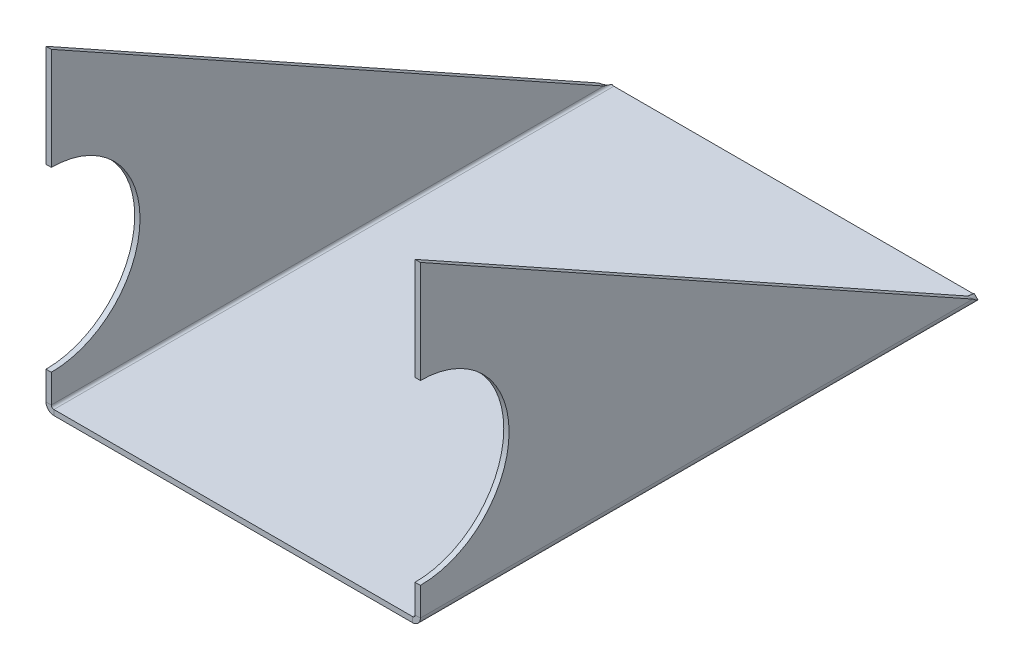
ISO-10303-21;
HEADER;
FILE_DESCRIPTION(('STEP AP214'),'2;1');
FILE_NAME('part.step','',(''),(''),'','','');
FILE_SCHEMA(('AUTOMOTIVE_DESIGN { 1 0 10303 214 1 1 1 1 }'));
ENDSEC;
DATA;
#1=APPLICATION_CONTEXT('core data for automotive mechanical design processes');
#2=APPLICATION_PROTOCOL_DEFINITION('international standard','automotive_design',2000,#1);
#3=PRODUCT_CONTEXT('',#1,'mechanical');
#4=PRODUCT('Part','Part','',(#3));
#5=PRODUCT_RELATED_PRODUCT_CATEGORY('part','',(#4));
#6=PRODUCT_DEFINITION_FORMATION('','',#4);
#7=PRODUCT_DEFINITION_CONTEXT('part definition',#1,'design');
#8=PRODUCT_DEFINITION('design','',#6,#7);
#9=PRODUCT_DEFINITION_SHAPE('','',#8);
#10=(LENGTH_UNIT() NAMED_UNIT(*) SI_UNIT(.MILLI.,.METRE.));
#11=(NAMED_UNIT(*) PLANE_ANGLE_UNIT() SI_UNIT($,.RADIAN.));
#12=(NAMED_UNIT(*) SI_UNIT($,.STERADIAN.) SOLID_ANGLE_UNIT());
#13=UNCERTAINTY_MEASURE_WITH_UNIT(LENGTH_MEASURE(1.E-05),#10,'distance_accuracy_value','');
#14=(GEOMETRIC_REPRESENTATION_CONTEXT(3) GLOBAL_UNCERTAINTY_ASSIGNED_CONTEXT((#13)) GLOBAL_UNIT_ASSIGNED_CONTEXT((#10,
#11,#12)) REPRESENTATION_CONTEXT('',''));
#15=CARTESIAN_POINT('',(0.,0.,0.));
#16=DIRECTION('',(0.,0.,1.));
#17=DIRECTION('',(1.,0.,0.));
#18=AXIS2_PLACEMENT_3D('',#15,#16,#17);
#19=CARTESIAN_POINT('',(-52.5207694696636,-1.524,-80.1699245510491));
#20=DIRECTION('',(0.,0.,-1.));
#21=DIRECTION('',(-1.,0.,0.));
#22=AXIS2_PLACEMENT_3D('',#19,#20,#21);
#23=PLANE('',#22);
#24=DIRECTION('',(-1.,0.,0.));
#25=VECTOR('',#24,1.);
#26=CARTESIAN_POINT('',(-52.5207694696636,-1.524,-80.1699245510491));
#27=LINE('',#26,#25);
#28=CARTESIAN_POINT('',(51.3437717819961,-1.524,-80.1699245510491));
#29=VERTEX_POINT('',#28);
#30=CARTESIAN_POINT('',(-51.3437717819962,-1.524,-80.1699245510491));
#31=VERTEX_POINT('',#30);
#32=EDGE_CURVE('E479',#29,#31,#27,.T.);
#33=ORIENTED_EDGE('',*,*,#32,.T.);
#34=DIRECTION('',(0.,1.,0.));
#35=VECTOR('',#34,1.);
#36=CARTESIAN_POINT('',(-51.3437717819962,-1.524,-80.1699245510491));
#37=LINE('',#36,#35);
#38=CARTESIAN_POINT('',(-51.3437717819962,0.,-80.1699245510491));
#39=VERTEX_POINT('',#38);
#40=EDGE_CURVE('E12',#31,#39,#37,.T.);
#41=ORIENTED_EDGE('',*,*,#40,.T.);
#42=DIRECTION('',(-1.,0.,0.));
#43=VECTOR('',#42,1.);
#44=CARTESIAN_POINT('',(-52.5207694696636,0.,-80.1699245510491));
#45=LINE('',#44,#43);
#46=CARTESIAN_POINT('',(51.3437717819961,0.,-80.1699245510491));
#47=VERTEX_POINT('',#46);
#48=EDGE_CURVE('E550',#47,#39,#45,.T.);
#49=ORIENTED_EDGE('',*,*,#48,.F.);
#50=DIRECTION('',(0.,1.,0.));
#51=VECTOR('',#50,1.);
#52=CARTESIAN_POINT('',(51.3437717819962,-1.524,-80.1699245510491));
#53=LINE('',#52,#51);
#54=EDGE_CURVE('E478',#29,#47,#53,.T.);
#55=ORIENTED_EDGE('',*,*,#54,.F.);
#56=EDGE_LOOP('',(#33,#41,#49,#55));
#57=FACE_BOUND('',#56,.T.);
#58=ADVANCED_FACE('F63',(#57),#23,.T.);
#59=CARTESIAN_POINT('',(52.5207694696636,-1.524,80.1699245510491));
#60=DIRECTION('',(0.,0.,1.));
#61=DIRECTION('',(1.,0.,0.));
#62=AXIS2_PLACEMENT_3D('',#59,#60,#61);
#63=PLANE('',#62);
#64=DIRECTION('',(1.,0.,0.));
#65=VECTOR('',#64,1.);
#66=CARTESIAN_POINT('',(52.5207694696636,0.,80.1699245510491));
#67=LINE('',#66,#65);
#68=CARTESIAN_POINT('',(-51.3437717819962,0.,80.1699245510491));
#69=VERTEX_POINT('',#68);
#70=CARTESIAN_POINT('',(51.3437717819961,0.,80.1699245510491));
#71=VERTEX_POINT('',#70);
#72=EDGE_CURVE('E90',#69,#71,#67,.T.);
#73=ORIENTED_EDGE('',*,*,#72,.F.);
#74=DIRECTION('',(0.,-1.,0.));
#75=VECTOR('',#74,1.);
#76=CARTESIAN_POINT('',(-51.3437717819962,-1.524,80.1699245510491));
#77=LINE('',#76,#75);
#78=CARTESIAN_POINT('',(-51.3437717819962,-1.524,80.1699245510491));
#79=VERTEX_POINT('',#78);
#80=EDGE_CURVE('E546',#69,#79,#77,.T.);
#81=ORIENTED_EDGE('',*,*,#80,.T.);
#82=DIRECTION('',(1.,0.,0.));
#83=VECTOR('',#82,1.);
#84=CARTESIAN_POINT('',(-61.8166499205288,-1.524,80.1699245510491));
#85=LINE('',#84,#83);
#86=CARTESIAN_POINT('',(51.3437717819961,-1.524,80.1699245510492));
#87=VERTEX_POINT('',#86);
#88=EDGE_CURVE('E543',#79,#87,#85,.T.);
#89=ORIENTED_EDGE('',*,*,#88,.T.);
#90=DIRECTION('',(0.,-1.,0.));
#91=VECTOR('',#90,1.);
#92=CARTESIAN_POINT('',(51.3437717819962,-1.524,80.1699245510491));
#93=LINE('',#92,#91);
#94=EDGE_CURVE('E485',#71,#87,#93,.T.);
#95=ORIENTED_EDGE('',*,*,#94,.F.);
#96=EDGE_LOOP('',(#73,#81,#89,#95));
#97=FACE_BOUND('',#96,.T.);
#98=ADVANCED_FACE('F526',(#97),#63,.T.);
#99=CARTESIAN_POINT('',(-87.2166499205288,0.,80.1699245510491));
#100=DIRECTION('',(0.,1.,0.));
#101=DIRECTION('',(0.,0.,1.));
#102=AXIS2_PLACEMENT_3D('',#99,#100,#101);
#103=PLANE('',#102);
#104=ORIENTED_EDGE('',*,*,#48,.T.);
#105=DIRECTION('',(0.,0.,1.));
#106=VECTOR('',#105,1.);
#107=CARTESIAN_POINT('',(-51.3437717819962,0.,80.1699245510491));
#108=LINE('',#107,#106);
#109=EDGE_CURVE('E74',#39,#69,#108,.T.);
#110=ORIENTED_EDGE('',*,*,#109,.T.);
#111=ORIENTED_EDGE('',*,*,#72,.T.);
#112=DIRECTION('',(0.,0.,1.));
#113=VECTOR('',#112,1.);
#114=CARTESIAN_POINT('',(51.3437717819961,0.,80.1699245510491));
#115=LINE('',#114,#113);
#116=EDGE_CURVE('E482',#47,#71,#115,.T.);
#117=ORIENTED_EDGE('',*,*,#116,.F.);
#118=EDGE_LOOP('',(#104,#110,#111,#117));
#119=FACE_BOUND('',#118,.T.);
#120=ADVANCED_FACE('F65',(#119),#103,.T.);
#121=CARTESIAN_POINT('',(-87.2166499205288,-1.524,80.1699245510491));
#122=DIRECTION('',(0.,1.,0.));
#123=DIRECTION('',(0.,0.,1.));
#124=AXIS2_PLACEMENT_3D('',#121,#122,#123);
#125=PLANE('',#124);
#126=DIRECTION('',(0.,0.,1.));
#127=VECTOR('',#126,1.);
#128=CARTESIAN_POINT('',(-51.3437717819962,-1.524,80.1699245510491));
#129=LINE('',#128,#127);
#130=EDGE_CURVE('E488',#31,#79,#129,.T.);
#131=ORIENTED_EDGE('',*,*,#130,.F.);
#132=ORIENTED_EDGE('',*,*,#32,.F.);
#133=DIRECTION('',(0.,0.,1.));
#134=VECTOR('',#133,1.);
#135=CARTESIAN_POINT('',(51.3437717819961,-1.524,80.1699245510491));
#136=LINE('',#135,#134);
#137=EDGE_CURVE('E471',#29,#87,#136,.T.);
#138=ORIENTED_EDGE('',*,*,#137,.T.);
#139=ORIENTED_EDGE('',*,*,#88,.F.);
#140=EDGE_LOOP('',(#131,#132,#138,#139));
#141=FACE_BOUND('',#140,.T.);
#142=ADVANCED_FACE('F432',(#141),#125,.F.);
#143=CARTESIAN_POINT('',(52.9422573715465,-0.861885589550284,-80.1699245510491));
#144=CARTESIAN_POINT('',(53.1515142734451,-0.652628687651668,-79.818018076489));
#145=CARTESIAN_POINT('',(53.3190532915098,-0.401881067026434,-79.4661641634137));
#146=CARTESIAN_POINT('',(53.5455344148725,0.144892732617424,-78.7624037757783));
#147=CARTESIAN_POINT('',(53.6043717819961,0.440666051314805,-78.410549862703));
#148=CARTESIAN_POINT('',(53.6043717819961,0.736599999999999,-78.0586433881429));
#149=CARTESIAN_POINT('',(51.8646266370182,0.215745144977997,-80.1699245510492));
#150=CARTESIAN_POINT('',(51.9328072366316,0.283925744591408,-79.818039926327));
#151=CARTESIAN_POINT('',(51.9874028356579,0.365634259058803,-79.4661641634137));
#152=CARTESIAN_POINT('',(52.06120005563,0.543796508380957,-78.7624037757783));
#153=CARTESIAN_POINT('',(52.0803717819961,0.640178071335974,-78.4105280128651));
#154=CARTESIAN_POINT('',(52.0803717819961,0.7366,-78.0586433881429));
#155=B_SPLINE_SURFACE_WITH_KNOTS('',1,3,((#143,#144,#145,#146,#147,#148),(#149,#150,#151,#152,
#153,#154)),.UNSPECIFIED.,.F.,.F.,.F.,(2,2),(4,2,4),(0.,1.),(0.,0.5,1.),.UNSPECIFIED.);
#156=CARTESIAN_POINT('',(52.9422573715465,-0.861885589550284,-80.1699245510491));
#157=CARTESIAN_POINT('',(51.8646266370182,0.215745144977997,-80.1699245510492));
#158=B_SPLINE_CURVE_WITH_KNOTS('',1,(#156,#157),.UNSPECIFIED.,.F.,.F.,(2,2),(0.,1.),.UNSPECIFIED.);
#159=CARTESIAN_POINT('',(51.8646266370182,0.215745144977997,-80.1699245510492));
#160=VERTEX_POINT('',#159);
#161=CARTESIAN_POINT('',(52.9422573715465,-0.861885589550284,-80.1699245510491));
#162=VERTEX_POINT('',#161);
#163=EDGE_CURVE('E459',#160,#162,#158,.F.);
#164=CARTESIAN_POINT('',(51.8646266370182,0.215745144977997,-80.1699245510492));
#165=CARTESIAN_POINT('',(51.9328072366316,0.283925744591408,-79.818039926327));
#166=CARTESIAN_POINT('',(51.9874028356579,0.365634259058803,-79.4661641634137));
#167=CARTESIAN_POINT('',(52.06120005563,0.543796508380957,-78.7624037757783));
#168=CARTESIAN_POINT('',(52.0803717819961,0.640178071335974,-78.4105280128651));
#169=CARTESIAN_POINT('',(52.0803717819961,0.7366,-78.0586433881429));
#170=B_SPLINE_CURVE_WITH_KNOTS('',3,(#164,#165,#166,#167,#168,#169),.UNSPECIFIED.,.F.,.F.,(4,2,
4),(0.,0.5,1.),.UNSPECIFIED.);
#171=CARTESIAN_POINT('',(52.0803717819962,0.736600000000011,-78.0586433881428));
#172=VERTEX_POINT('',#171);
#173=EDGE_CURVE('E333',#160,#172,#170,.T.);
#174=CARTESIAN_POINT('',(52.0803717819961,0.7366,-78.0586433881429));
#175=CARTESIAN_POINT('',(53.6043717819961,0.736599999999999,-78.0586433881429));
#176=B_SPLINE_CURVE_WITH_KNOTS('',1,(#174,#175),.UNSPECIFIED.,.F.,.F.,(2,2),(0.,1.),.UNSPECIFIED.);
#177=CARTESIAN_POINT('',(53.6043717819962,0.73659999999999,-78.0586433881428));
#178=VERTEX_POINT('',#177);
#179=EDGE_CURVE('E495',#178,#172,#176,.F.);
#180=CARTESIAN_POINT('',(53.6043717819961,0.736599999999999,-78.0586433881429));
#181=CARTESIAN_POINT('',(53.6043717819961,0.440666051314805,-78.410549862703));
#182=CARTESIAN_POINT('',(53.5455344148725,0.144892732617424,-78.7624037757783));
#183=CARTESIAN_POINT('',(53.3190532915098,-0.401881067026434,-79.4661641634137));
#184=CARTESIAN_POINT('',(53.1515142734451,-0.652628687651668,-79.818018076489));
#185=CARTESIAN_POINT('',(52.9422573715465,-0.861885589550284,-80.1699245510491));
#186=B_SPLINE_CURVE_WITH_KNOTS('',3,(#180,#181,#182,#183,#184,#185),.UNSPECIFIED.,.F.,.F.,(4,2,
4),(0.,0.5,1.),.UNSPECIFIED.);
#187=EDGE_CURVE('E363',#162,#178,#186,.F.);
#188=ORIENTED_EDGE('',*,*,#163,.F.);
#189=ORIENTED_EDGE('',*,*,#173,.T.);
#190=ORIENTED_EDGE('',*,*,#179,.F.);
#191=ORIENTED_EDGE('',*,*,#187,.F.);
#192=EDGE_LOOP('',(#188,#189,#190,#191));
#193=FACE_BOUND('',#192,.T.);
#194=ADVANCED_FACE('F421',(#193),#155,.T.);
#195=CARTESIAN_POINT('',(51.3437717819961,0.7366,80.1699245510492));
#196=DIRECTION('',(0.,0.,1.));
#197=DIRECTION('',(1.,0.,0.));
#198=AXIS2_PLACEMENT_3D('',#195,#196,#197);
#199=PLANE('',#198);
#200=DIRECTION('',(1.,0.,0.));
#201=VECTOR('',#200,1.);
#202=CARTESIAN_POINT('',(53.6043717819962,0.73659999999999,80.1699245510491));
#203=LINE('',#202,#201);
#204=CARTESIAN_POINT('',(52.0803717819962,0.736599999999983,80.1699245510491));
#205=VERTEX_POINT('',#204);
#206=CARTESIAN_POINT('',(53.6043717819961,0.73660000000006,80.1699245510492));
#207=VERTEX_POINT('',#206);
#208=EDGE_CURVE('E336',#205,#207,#203,.T.);
#209=ORIENTED_EDGE('',*,*,#208,.F.);
#210=CARTESIAN_POINT('',(51.3437717819961,0.7366,80.1699245510491));
#211=DIRECTION('',(0.,0.,1.));
#212=DIRECTION('',(1.,0.,0.));
#213=AXIS2_PLACEMENT_3D('',#210,#211,#212);
#214=CIRCLE('',#213,0.7366);
#215=EDGE_CURVE('E364',#205,#71,#214,.F.);
#216=ORIENTED_EDGE('',*,*,#215,.T.);
#217=ORIENTED_EDGE('',*,*,#94,.T.);
#218=CARTESIAN_POINT('',(51.3437717819961,0.7366,80.1699245510492));
#219=DIRECTION('',(0.,0.,-1.));
#220=DIRECTION('',(1.,0.,0.));
#221=AXIS2_PLACEMENT_3D('',#218,#219,#220);
#222=CIRCLE('',#221,2.2606);
#223=EDGE_CURVE('E359',#207,#87,#222,.T.);
#224=ORIENTED_EDGE('',*,*,#223,.F.);
#225=EDGE_LOOP('',(#209,#216,#217,#224));
#226=FACE_BOUND('',#225,.T.);
#227=ADVANCED_FACE('F393',(#226),#199,.T.);
#228=CARTESIAN_POINT('',(51.3437717819961,0.7366,-80.1699245510491));
#229=DIRECTION('',(0.,0.,-1.));
#230=DIRECTION('',(-1.,0.,0.));
#231=AXIS2_PLACEMENT_3D('',#228,#229,#230);
#232=PLANE('',#231);
#233=CARTESIAN_POINT('',(51.3437717819961,0.7366,-80.1699245510491));
#234=DIRECTION('',(0.,0.,1.));
#235=DIRECTION('',(1.,0.,0.));
#236=AXIS2_PLACEMENT_3D('',#233,#234,#235);
#237=CIRCLE('',#236,0.7366);
#238=EDGE_CURVE('E367',#47,#160,#237,.T.);
#239=ORIENTED_EDGE('',*,*,#238,.T.);
#240=ORIENTED_EDGE('',*,*,#163,.T.);
#241=CARTESIAN_POINT('',(51.3437717819961,0.7366,-80.1699245510491));
#242=DIRECTION('',(0.,0.,1.));
#243=DIRECTION('',(-1.,0.,0.));
#244=AXIS2_PLACEMENT_3D('',#241,#242,#243);
#245=CIRCLE('',#244,2.2606);
#246=EDGE_CURVE('E362',#29,#162,#245,.T.);
#247=ORIENTED_EDGE('',*,*,#246,.F.);
#248=ORIENTED_EDGE('',*,*,#54,.T.);
#249=EDGE_LOOP('',(#239,#240,#247,#248));
#250=FACE_BOUND('',#249,.T.);
#251=ADVANCED_FACE('F385',(#250),#232,.T.);
#252=CARTESIAN_POINT('',(51.3437717819961,0.7366,-160.364369734398));
#253=DIRECTION('',(0.,0.,1.));
#254=DIRECTION('',(1.,0.,0.));
#255=AXIS2_PLACEMENT_3D('',#252,#253,#254);
#256=CYLINDRICAL_SURFACE('',#255,2.2606);
#257=ORIENTED_EDGE('',*,*,#137,.F.);
#258=ORIENTED_EDGE('',*,*,#246,.T.);
#259=ORIENTED_EDGE('',*,*,#187,.T.);
#260=DIRECTION('',(0.,0.,1.));
#261=VECTOR('',#260,1.);
#262=CARTESIAN_POINT('',(53.6043717819962,0.736600000000004,80.1699245510491));
#263=LINE('',#262,#261);
#264=EDGE_CURVE('E358',#178,#207,#263,.T.);
#265=ORIENTED_EDGE('',*,*,#264,.T.);
#266=ORIENTED_EDGE('',*,*,#223,.T.);
#267=EDGE_LOOP('',(#257,#258,#259,#265,#266));
#268=FACE_BOUND('',#267,.T.);
#269=ADVANCED_FACE('F374',(#268),#256,.T.);
#270=CARTESIAN_POINT('',(51.3437717819961,0.7366,-160.364369734398));
#271=DIRECTION('',(0.,0.,1.));
#272=DIRECTION('',(1.,0.,0.));
#273=AXIS2_PLACEMENT_3D('',#270,#271,#272);
#274=CYLINDRICAL_SURFACE('',#273,0.7366);
#275=ORIENTED_EDGE('',*,*,#116,.T.);
#276=ORIENTED_EDGE('',*,*,#215,.F.);
#277=DIRECTION('',(0.,0.,1.));
#278=VECTOR('',#277,1.);
#279=CARTESIAN_POINT('',(52.0803717819962,0.736599999999997,80.1699245510491));
#280=LINE('',#279,#278);
#281=EDGE_CURVE('E346',#172,#205,#280,.T.);
#282=ORIENTED_EDGE('',*,*,#281,.F.);
#283=ORIENTED_EDGE('',*,*,#173,.F.);
#284=ORIENTED_EDGE('',*,*,#238,.F.);
#285=EDGE_LOOP('',(#275,#276,#282,#283,#284));
#286=FACE_BOUND('',#285,.T.);
#287=ADVANCED_FACE('F384',(#286),#274,.F.);
#288=CARTESIAN_POINT('',(53.6043717819961,34.2554827631978,80.169924551049));
#289=DIRECTION('',(-1.,0.,0.));
#290=DIRECTION('',(0.,0.,1.));
#291=AXIS2_PLACEMENT_3D('',#288,#289,#290);
#292=CYLINDRICAL_SURFACE('',#291,25.4);
#293=CARTESIAN_POINT('',(52.0803717819961,34.2554827631978,80.169924551049));
#294=DIRECTION('',(1.,0.,0.));
#295=DIRECTION('',(0.,0.,1.));
#296=AXIS2_PLACEMENT_3D('',#293,#294,#295);
#297=CIRCLE('',#296,25.4);
#298=CARTESIAN_POINT('',(52.0803717819962,8.85548276319775,80.1699245510491));
#299=VERTEX_POINT('',#298);
#300=CARTESIAN_POINT('',(52.080371781996,59.6554827631978,80.169924551049));
#301=VERTEX_POINT('',#300);
#302=EDGE_CURVE('E341',#299,#301,#297,.T.);
#303=ORIENTED_EDGE('',*,*,#302,.F.);
#304=DIRECTION('',(-1.,0.,0.));
#305=VECTOR('',#304,1.);
#306=CARTESIAN_POINT('',(53.6043717819962,8.85548276319775,80.1699245510491));
#307=LINE('',#306,#305);
#308=CARTESIAN_POINT('',(53.6043717819962,8.85548276319775,80.1699245510491));
#309=VERTEX_POINT('',#308);
#310=EDGE_CURVE('E325',#309,#299,#307,.T.);
#311=ORIENTED_EDGE('',*,*,#310,.F.);
#312=CARTESIAN_POINT('',(53.6043717819961,34.2554827631978,80.169924551049));
#313=DIRECTION('',(1.,0.,0.));
#314=DIRECTION('',(0.,0.,1.));
#315=AXIS2_PLACEMENT_3D('',#312,#313,#314);
#316=CIRCLE('',#315,25.4);
#317=CARTESIAN_POINT('',(53.604371781996,59.6554827631978,80.169924551049));
#318=VERTEX_POINT('',#317);
#319=EDGE_CURVE('E355',#309,#318,#316,.T.);
#320=ORIENTED_EDGE('',*,*,#319,.T.);
#321=DIRECTION('',(-1.,0.,0.));
#322=VECTOR('',#321,1.);
#323=CARTESIAN_POINT('',(53.604371781996,59.6554827631978,80.169924551049));
#324=LINE('',#323,#322);
#325=EDGE_CURVE('E353',#318,#301,#324,.T.);
#326=ORIENTED_EDGE('',*,*,#325,.T.);
#327=EDGE_LOOP('',(#303,#311,#320,#326));
#328=FACE_BOUND('',#327,.T.);
#329=ADVANCED_FACE('F288',(#328),#292,.F.);
#330=CARTESIAN_POINT('',(53.604371781996,59.6554827631978,80.169924551049));
#331=DIRECTION('',(0.,0.,1.));
#332=DIRECTION('',(0.,1.,0.));
#333=AXIS2_PLACEMENT_3D('',#330,#331,#332);
#334=PLANE('',#333);
#335=DIRECTION('',(0.,1.,0.));
#336=VECTOR('',#335,1.);
#337=CARTESIAN_POINT('',(52.080371781996,59.6554827631978,80.169924551049));
#338=LINE('',#337,#336);
#339=CARTESIAN_POINT('',(52.0803717819959,88.9459118905102,80.1699245510491));
#340=VERTEX_POINT('',#339);
#341=EDGE_CURVE('E338',#301,#340,#338,.T.);
#342=ORIENTED_EDGE('',*,*,#341,.F.);
#343=ORIENTED_EDGE('',*,*,#325,.F.);
#344=DIRECTION('',(0.,1.,0.));
#345=VECTOR('',#344,1.);
#346=CARTESIAN_POINT('',(53.604371781996,59.6554827631978,80.169924551049));
#347=LINE('',#346,#345);
#348=CARTESIAN_POINT('',(53.6043717819959,88.9459118905102,80.1699245510491));
#349=VERTEX_POINT('',#348);
#350=EDGE_CURVE('E350',#318,#349,#347,.T.);
#351=ORIENTED_EDGE('',*,*,#350,.T.);
#352=DIRECTION('',(-1.,0.,0.));
#353=VECTOR('',#352,1.);
#354=CARTESIAN_POINT('',(53.6043717819959,88.9459118905102,80.1699245510491));
#355=LINE('',#354,#353);
#356=EDGE_CURVE('E347',#349,#340,#355,.T.);
#357=ORIENTED_EDGE('',*,*,#356,.T.);
#358=EDGE_LOOP('',(#342,#343,#351,#357));
#359=FACE_BOUND('',#358,.T.);
#360=ADVANCED_FACE('F808',(#359),#334,.T.);
#361=CARTESIAN_POINT('',(53.6043717819967,-140.17781707786,80.1699245510491));
#362=DIRECTION('',(-1.,0.,0.));
#363=DIRECTION('',(0.,0.,1.));
#364=AXIS2_PLACEMENT_3D('',#361,#362,#363);
#365=PLANE('',#364);
#366=ORIENTED_EDGE('',*,*,#264,.F.);
#367=DIRECTION('',(0.,-0.486927072032284,-0.873442629210452));
#368=VECTOR('',#367,1.);
#369=CARTESIAN_POINT('',(53.6043717819959,88.9459118905102,80.1699245510491));
#370=LINE('',#369,#368);
#371=EDGE_CURVE('E349',#349,#178,#370,.T.);
#372=ORIENTED_EDGE('',*,*,#371,.F.);
#373=ORIENTED_EDGE('',*,*,#350,.F.);
#374=ORIENTED_EDGE('',*,*,#319,.F.);
#375=DIRECTION('',(0.,1.,0.));
#376=VECTOR('',#375,1.);
#377=CARTESIAN_POINT('',(53.6043717819966,-114.77781707786,80.1699245510491));
#378=LINE('',#377,#376);
#379=EDGE_CURVE('E334',#207,#309,#378,.T.);
#380=ORIENTED_EDGE('',*,*,#379,.F.);
#381=EDGE_LOOP('',(#366,#372,#373,#374,#380));
#382=FACE_BOUND('',#381,.T.);
#383=ADVANCED_FACE('F518',(#382),#365,.F.);
#384=CARTESIAN_POINT('',(53.6043717819959,88.9459118905102,80.1699245510491));
#385=DIRECTION('',(0.,0.873442629210452,-0.486927072032284));
#386=DIRECTION('',(0.,-0.486927072032284,-0.873442629210452));
#387=AXIS2_PLACEMENT_3D('',#384,#385,#386);
#388=PLANE('',#387);
#389=ORIENTED_EDGE('',*,*,#371,.T.);
#390=ORIENTED_EDGE('',*,*,#179,.T.);
#391=DIRECTION('',(0.,-0.486927072032284,-0.873442629210452));
#392=VECTOR('',#391,1.);
#393=CARTESIAN_POINT('',(52.0803717819959,88.9459118905102,80.1699245510491));
#394=LINE('',#393,#392);
#395=EDGE_CURVE('E581',#340,#172,#394,.T.);
#396=ORIENTED_EDGE('',*,*,#395,.F.);
#397=ORIENTED_EDGE('',*,*,#356,.F.);
#398=EDGE_LOOP('',(#389,#390,#396,#397));
#399=FACE_BOUND('',#398,.T.);
#400=ADVANCED_FACE('F508',(#399),#388,.T.);
#401=CARTESIAN_POINT('',(52.0803717819967,-140.17781707786,80.1699245510491));
#402=DIRECTION('',(-1.,0.,0.));
#403=DIRECTION('',(0.,0.,1.));
#404=AXIS2_PLACEMENT_3D('',#401,#402,#403);
#405=PLANE('',#404);
#406=ORIENTED_EDGE('',*,*,#395,.T.);
#407=ORIENTED_EDGE('',*,*,#281,.T.);
#408=DIRECTION('',(0.,1.,0.));
#409=VECTOR('',#408,1.);
#410=CARTESIAN_POINT('',(52.0803717819962,-0.440397687667439,80.1699245510491));
#411=LINE('',#410,#409);
#412=EDGE_CURVE('E344',#205,#299,#411,.T.);
#413=ORIENTED_EDGE('',*,*,#412,.T.);
#414=ORIENTED_EDGE('',*,*,#302,.T.);
#415=ORIENTED_EDGE('',*,*,#341,.T.);
#416=EDGE_LOOP('',(#406,#407,#413,#414,#415));
#417=FACE_BOUND('',#416,.T.);
#418=ADVANCED_FACE('F517',(#417),#405,.T.);
#419=CARTESIAN_POINT('',(53.6043717819962,-0.440397687667432,80.1699245510491));
#420=DIRECTION('',(0.,0.,1.));
#421=DIRECTION('',(0.,1.,0.));
#422=AXIS2_PLACEMENT_3D('',#419,#420,#421);
#423=PLANE('',#422);
#424=ORIENTED_EDGE('',*,*,#412,.F.);
#425=ORIENTED_EDGE('',*,*,#208,.T.);
#426=ORIENTED_EDGE('',*,*,#379,.T.);
#427=ORIENTED_EDGE('',*,*,#310,.T.);
#428=EDGE_LOOP('',(#424,#425,#426,#427));
#429=FACE_BOUND('',#428,.T.);
#430=ADVANCED_FACE('F387',(#429),#423,.T.);
#431=CARTESIAN_POINT('',(-51.3437717819962,0.7366,-80.1699245510491));
#432=DIRECTION('',(0.,0.,-1.));
#433=DIRECTION('',(-1.,0.,0.));
#434=AXIS2_PLACEMENT_3D('',#431,#432,#433);
#435=PLANE('',#434);
#436=CARTESIAN_POINT('',(-51.8646266370182,0.215745144977973,-80.1699245510491));
#437=CARTESIAN_POINT('',(-52.9422573715465,-0.861885589550359,-80.1699245510491));
#438=B_SPLINE_CURVE_WITH_KNOTS('',1,(#436,#437),.UNSPECIFIED.,.F.,.F.,(2,2),(0.,1.),.UNSPECIFIED.);
#439=CARTESIAN_POINT('',(-51.8646266370182,0.215745144977973,-80.1699245510491));
#440=VERTEX_POINT('',#439);
#441=CARTESIAN_POINT('',(-52.9422573715465,-0.86188558955036,-80.1699245510491));
#442=VERTEX_POINT('',#441);
#443=EDGE_CURVE('E313',#440,#442,#438,.T.);
#444=ORIENTED_EDGE('',*,*,#443,.F.);
#445=CARTESIAN_POINT('',(-51.3437717819962,0.7366,-80.1699245510491));
#446=DIRECTION('',(0.,0.,-1.));
#447=DIRECTION('',(-1.,0.,0.));
#448=AXIS2_PLACEMENT_3D('',#445,#446,#447);
#449=CIRCLE('',#448,0.7366);
#450=EDGE_CURVE('E82',#440,#39,#449,.F.);
#451=ORIENTED_EDGE('',*,*,#450,.T.);
#452=ORIENTED_EDGE('',*,*,#40,.F.);
#453=CARTESIAN_POINT('',(-51.3437717819962,0.7366,-80.1699245510491));
#454=DIRECTION('',(0.,0.,1.));
#455=DIRECTION('',(-1.,0.,0.));
#456=AXIS2_PLACEMENT_3D('',#453,#454,#455);
#457=CIRCLE('',#456,2.2606);
#458=EDGE_CURVE('E219',#442,#31,#457,.T.);
#459=ORIENTED_EDGE('',*,*,#458,.F.);
#460=EDGE_LOOP('',(#444,#451,#452,#459));
#461=FACE_BOUND('',#460,.T.);
#462=ADVANCED_FACE('F286',(#461),#435,.T.);
#463=CARTESIAN_POINT('',(-51.3437717819962,0.7366,80.1699245510491));
#464=DIRECTION('',(0.,0.,1.));
#465=DIRECTION('',(1.,0.,0.));
#466=AXIS2_PLACEMENT_3D('',#463,#464,#465);
#467=PLANE('',#466);
#468=ORIENTED_EDGE('',*,*,#80,.F.);
#469=CARTESIAN_POINT('',(-51.3437717819962,0.7366,80.1699245510491));
#470=DIRECTION('',(0.,0.,-1.));
#471=DIRECTION('',(-1.,0.,0.));
#472=AXIS2_PLACEMENT_3D('',#469,#470,#471);
#473=CIRCLE('',#472,0.7366);
#474=CARTESIAN_POINT('',(-52.0803717819962,0.736600000000032,80.1699245510491));
#475=VERTEX_POINT('',#474);
#476=EDGE_CURVE('E220',#69,#475,#473,.T.);
#477=ORIENTED_EDGE('',*,*,#476,.T.);
#478=DIRECTION('',(-1.,0.,0.));
#479=VECTOR('',#478,1.);
#480=CARTESIAN_POINT('',(-53.6043717819962,0.736600000000011,80.1699245510491));
#481=LINE('',#480,#479);
#482=CARTESIAN_POINT('',(-53.6043717819962,0.736600000000011,80.1699245510491));
#483=VERTEX_POINT('',#482);
#484=EDGE_CURVE('E207',#475,#483,#481,.T.);
#485=ORIENTED_EDGE('',*,*,#484,.T.);
#486=CARTESIAN_POINT('',(-51.3437717819962,0.7366,80.1699245510491));
#487=DIRECTION('',(0.,0.,-1.));
#488=DIRECTION('',(1.,0.,0.));
#489=AXIS2_PLACEMENT_3D('',#486,#487,#488);
#490=CIRCLE('',#489,2.2606);
#491=EDGE_CURVE('E215',#79,#483,#490,.T.);
#492=ORIENTED_EDGE('',*,*,#491,.F.);
#493=EDGE_LOOP('',(#468,#477,#485,#492));
#494=FACE_BOUND('',#493,.T.);
#495=ADVANCED_FACE('F255',(#494),#467,.T.);
#496=CARTESIAN_POINT('',(-53.6043717819962,0.736599999999999,-78.0586433881427));
#497=CARTESIAN_POINT('',(-53.6043717819962,0.44066605131478,-78.4105498627029));
#498=CARTESIAN_POINT('',(-53.5455344148726,0.144892732617387,-78.7624037757782));
#499=CARTESIAN_POINT('',(-53.3190532915098,-0.401881067026497,-79.4661641634136));
#500=CARTESIAN_POINT('',(-53.1515142734451,-0.652628687651736,-79.8180180764889));
#501=CARTESIAN_POINT('',(-52.9422573715465,-0.861885589550359,-80.1699245510491));
#502=CARTESIAN_POINT('',(-52.0803717819962,0.7366,-78.0586433881427));
#503=CARTESIAN_POINT('',(-52.0803717819962,0.64017807133598,-78.4105280128649));
#504=CARTESIAN_POINT('',(-52.0612000556301,0.543796508380946,-78.7624037757782));
#505=CARTESIAN_POINT('',(-51.987402835658,0.365634259058781,-79.4661641634136));
#506=CARTESIAN_POINT('',(-51.9328072366316,0.283925744591396,-79.8180399263269));
#507=CARTESIAN_POINT('',(-51.8646266370182,0.215745144977973,-80.1699245510491));
#508=B_SPLINE_SURFACE_WITH_KNOTS('',1,3,((#496,#497,#498,#499,#500,#501),(#502,#503,#504,#505,
#506,#507)),.UNSPECIFIED.,.F.,.F.,.F.,(2,2),(4,2,4),(0.,1.),(0.,0.5,1.),.UNSPECIFIED.);
#509=CARTESIAN_POINT('',(-52.0803717819962,0.7366,-78.0586433881427));
#510=CARTESIAN_POINT('',(-52.0803717819962,0.64017807133598,-78.4105280128649));
#511=CARTESIAN_POINT('',(-52.0612000556301,0.543796508380946,-78.7624037757782));
#512=CARTESIAN_POINT('',(-51.987402835658,0.365634259058781,-79.4661641634136));
#513=CARTESIAN_POINT('',(-51.9328072366316,0.283925744591396,-79.8180399263269));
#514=CARTESIAN_POINT('',(-51.8646266370182,0.215745144977973,-80.1699245510491));
#515=B_SPLINE_CURVE_WITH_KNOTS('',3,(#509,#510,#511,#512,#513,#514),.UNSPECIFIED.,.F.,.F.,(4,2,
4),(0.,0.5,1.),.UNSPECIFIED.);
#516=CARTESIAN_POINT('',(-52.0803717819962,0.73659999999999,-78.0586433881428));
#517=VERTEX_POINT('',#516);
#518=EDGE_CURVE('E223',#517,#440,#515,.T.);
#519=CARTESIAN_POINT('',(-52.9422573715465,-0.861885589550359,-80.1699245510491));
#520=CARTESIAN_POINT('',(-53.1515142734451,-0.652628687651736,-79.8180180764889));
#521=CARTESIAN_POINT('',(-53.3190532915098,-0.401881067026497,-79.4661641634136));
#522=CARTESIAN_POINT('',(-53.5455344148726,0.144892732617387,-78.7624037757782));
#523=CARTESIAN_POINT('',(-53.6043717819962,0.44066605131478,-78.4105498627029));
#524=CARTESIAN_POINT('',(-53.6043717819962,0.736599999999999,-78.0586433881427));
#525=B_SPLINE_CURVE_WITH_KNOTS('',3,(#519,#520,#521,#522,#523,#524),.UNSPECIFIED.,.F.,.F.,(4,2,
4),(0.,0.5,1.),.UNSPECIFIED.);
#526=CARTESIAN_POINT('',(-53.6043717819962,0.736600000000007,-78.0586433881427));
#527=VERTEX_POINT('',#526);
#528=EDGE_CURVE('E218',#527,#442,#525,.F.);
#529=CARTESIAN_POINT('',(-53.6043717819962,0.736599999999999,-78.0586433881427));
#530=CARTESIAN_POINT('',(-52.0803717819962,0.7366,-78.0586433881427));
#531=B_SPLINE_CURVE_WITH_KNOTS('',1,(#529,#530),.UNSPECIFIED.,.F.,.F.,(2,2),(0.,1.),.UNSPECIFIED.);
#532=EDGE_CURVE('E188',#527,#517,#531,.T.);
#533=ORIENTED_EDGE('',*,*,#518,.T.);
#534=ORIENTED_EDGE('',*,*,#443,.T.);
#535=ORIENTED_EDGE('',*,*,#528,.F.);
#536=ORIENTED_EDGE('',*,*,#532,.T.);
#537=EDGE_LOOP('',(#533,#534,#535,#536));
#538=FACE_BOUND('',#537,.T.);
#539=ADVANCED_FACE('F247',(#538),#508,.T.);
#540=CARTESIAN_POINT('',(-51.3437717819961,0.7366,160.364369734398));
#541=DIRECTION('',(0.,0.,-1.));
#542=DIRECTION('',(-1.,0.,0.));
#543=AXIS2_PLACEMENT_3D('',#540,#541,#542);
#544=CYLINDRICAL_SURFACE('',#543,2.2606);
#545=DIRECTION('',(0.,0.,1.));
#546=VECTOR('',#545,1.);
#547=CARTESIAN_POINT('',(-53.6043717819962,0.736600000000011,80.1699245510491));
#548=LINE('',#547,#546);
#549=EDGE_CURVE('E559',#527,#483,#548,.T.);
#550=ORIENTED_EDGE('',*,*,#549,.F.);
#551=ORIENTED_EDGE('',*,*,#528,.T.);
#552=ORIENTED_EDGE('',*,*,#458,.T.);
#553=ORIENTED_EDGE('',*,*,#130,.T.);
#554=ORIENTED_EDGE('',*,*,#491,.T.);
#555=EDGE_LOOP('',(#550,#551,#552,#553,#554));
#556=FACE_BOUND('',#555,.T.);
#557=ADVANCED_FACE('F237',(#556),#544,.T.);
#558=CARTESIAN_POINT('',(-51.3437717819961,0.7366,160.364369734398));
#559=DIRECTION('',(0.,0.,-1.));
#560=DIRECTION('',(-1.,0.,0.));
#561=AXIS2_PLACEMENT_3D('',#558,#559,#560);
#562=CYLINDRICAL_SURFACE('',#561,0.7366);
#563=DIRECTION('',(0.,0.,1.));
#564=VECTOR('',#563,1.);
#565=CARTESIAN_POINT('',(-52.0803717819962,0.736600000000004,80.1699245510491));
#566=LINE('',#565,#564);
#567=EDGE_CURVE('E211',#517,#475,#566,.T.);
#568=ORIENTED_EDGE('',*,*,#567,.T.);
#569=ORIENTED_EDGE('',*,*,#476,.F.);
#570=ORIENTED_EDGE('',*,*,#109,.F.);
#571=ORIENTED_EDGE('',*,*,#450,.F.);
#572=ORIENTED_EDGE('',*,*,#518,.F.);
#573=EDGE_LOOP('',(#568,#569,#570,#571,#572));
#574=FACE_BOUND('',#573,.T.);
#575=ADVANCED_FACE('F246',(#574),#562,.F.);
#576=CARTESIAN_POINT('',(-53.604371781996,59.6554827631978,80.169924551049));
#577=DIRECTION('',(0.,0.,1.));
#578=DIRECTION('',(0.,-1.,0.));
#579=AXIS2_PLACEMENT_3D('',#576,#577,#578);
#580=PLANE('',#579);
#581=DIRECTION('',(0.,-1.,0.));
#582=VECTOR('',#581,1.);
#583=CARTESIAN_POINT('',(-52.080371781996,59.6554827631978,80.169924551049));
#584=LINE('',#583,#582);
#585=CARTESIAN_POINT('',(-52.0803717819959,88.9459118905102,80.169924551049));
#586=VERTEX_POINT('',#585);
#587=CARTESIAN_POINT('',(-52.080371781996,59.6554827631978,80.169924551049));
#588=VERTEX_POINT('',#587);
#589=EDGE_CURVE('E199',#586,#588,#584,.T.);
#590=ORIENTED_EDGE('',*,*,#589,.F.);
#591=DIRECTION('',(1.,0.,0.));
#592=VECTOR('',#591,1.);
#593=CARTESIAN_POINT('',(-53.6043717819959,88.9459118905102,80.169924551049));
#594=LINE('',#593,#592);
#595=CARTESIAN_POINT('',(-53.6043717819959,88.9459118905102,80.169924551049));
#596=VERTEX_POINT('',#595);
#597=EDGE_CURVE('E185',#596,#586,#594,.T.);
#598=ORIENTED_EDGE('',*,*,#597,.F.);
#599=DIRECTION('',(0.,-1.,0.));
#600=VECTOR('',#599,1.);
#601=CARTESIAN_POINT('',(-53.604371781996,59.6554827631978,80.169924551049));
#602=LINE('',#601,#600);
#603=CARTESIAN_POINT('',(-53.604371781996,59.6554827631978,80.169924551049));
#604=VERTEX_POINT('',#603);
#605=EDGE_CURVE('E197',#596,#604,#602,.T.);
#606=ORIENTED_EDGE('',*,*,#605,.T.);
#607=DIRECTION('',(1.,0.,0.));
#608=VECTOR('',#607,1.);
#609=CARTESIAN_POINT('',(-53.604371781996,59.6554827631978,80.169924551049));
#610=LINE('',#609,#608);
#611=EDGE_CURVE('E206',#604,#588,#610,.T.);
#612=ORIENTED_EDGE('',*,*,#611,.T.);
#613=EDGE_LOOP('',(#590,#598,#606,#612));
#614=FACE_BOUND('',#613,.T.);
#615=ADVANCED_FACE('F196',(#614),#580,.T.);
#616=CARTESIAN_POINT('',(-53.604371781996,34.2554827631978,80.1699245510491));
#617=DIRECTION('',(1.,0.,0.));
#618=DIRECTION('',(0.,0.,1.));
#619=AXIS2_PLACEMENT_3D('',#616,#617,#618);
#620=CYLINDRICAL_SURFACE('',#619,25.4);
#621=CARTESIAN_POINT('',(-52.080371781996,34.2554827631978,80.1699245510491));
#622=DIRECTION('',(-1.,0.,0.));
#623=DIRECTION('',(0.,0.,1.));
#624=AXIS2_PLACEMENT_3D('',#621,#622,#623);
#625=CIRCLE('',#624,25.4);
#626=CARTESIAN_POINT('',(-52.0803717819961,8.85548276319778,80.169924551049));
#627=VERTEX_POINT('',#626);
#628=EDGE_CURVE('E607',#588,#627,#625,.T.);
#629=ORIENTED_EDGE('',*,*,#628,.F.);
#630=ORIENTED_EDGE('',*,*,#611,.F.);
#631=CARTESIAN_POINT('',(-53.604371781996,34.2554827631978,80.1699245510491));
#632=DIRECTION('',(-1.,0.,0.));
#633=DIRECTION('',(0.,0.,1.));
#634=AXIS2_PLACEMENT_3D('',#631,#632,#633);
#635=CIRCLE('',#634,25.4);
#636=CARTESIAN_POINT('',(-53.6043717819961,8.85548276319779,80.169924551049));
#637=VERTEX_POINT('',#636);
#638=EDGE_CURVE('E205',#604,#637,#635,.T.);
#639=ORIENTED_EDGE('',*,*,#638,.T.);
#640=DIRECTION('',(1.,0.,0.));
#641=VECTOR('',#640,1.);
#642=CARTESIAN_POINT('',(-53.6043717819961,8.85548276319779,80.169924551049));
#643=LINE('',#642,#641);
#644=EDGE_CURVE('E562',#637,#627,#643,.T.);
#645=ORIENTED_EDGE('',*,*,#644,.T.);
#646=EDGE_LOOP('',(#629,#630,#639,#645));
#647=FACE_BOUND('',#646,.T.);
#648=ADVANCED_FACE('F605',(#647),#620,.F.);
#649=CARTESIAN_POINT('',(-53.604371781996,34.2554827631978,80.1699245510491));
#650=DIRECTION('',(1.,0.,0.));
#651=DIRECTION('',(0.,0.,1.));
#652=AXIS2_PLACEMENT_3D('',#649,#650,#651);
#653=PLANE('',#652);
#654=DIRECTION('',(0.,0.486927072032284,0.873442629210452));
#655=VECTOR('',#654,1.);
#656=CARTESIAN_POINT('',(-53.6043717819962,-0.440397687667467,-80.1699245510491));
#657=LINE('',#656,#655);
#658=EDGE_CURVE('E182',#527,#596,#657,.T.);
#659=ORIENTED_EDGE('',*,*,#658,.F.);
#660=ORIENTED_EDGE('',*,*,#549,.T.);
#661=DIRECTION('',(0.,-1.,0.));
#662=VECTOR('',#661,1.);
#663=CARTESIAN_POINT('',(-53.6043717819961,8.85548276319779,80.169924551049));
#664=LINE('',#663,#662);
#665=EDGE_CURVE('E561',#637,#483,#664,.T.);
#666=ORIENTED_EDGE('',*,*,#665,.F.);
#667=ORIENTED_EDGE('',*,*,#638,.F.);
#668=ORIENTED_EDGE('',*,*,#605,.F.);
#669=EDGE_LOOP('',(#659,#660,#666,#667,#668));
#670=FACE_BOUND('',#669,.T.);
#671=ADVANCED_FACE('F202',(#670),#653,.F.);
#672=CARTESIAN_POINT('',(-53.6043717819965,-105.481936626995,80.1699245510491));
#673=DIRECTION('',(0.,0.,1.));
#674=DIRECTION('',(0.,-1.,0.));
#675=AXIS2_PLACEMENT_3D('',#672,#673,#674);
#676=PLANE('',#675);
#677=ORIENTED_EDGE('',*,*,#484,.F.);
#678=DIRECTION('',(0.,-1.,0.));
#679=VECTOR('',#678,1.);
#680=CARTESIAN_POINT('',(-52.0803717819965,-105.481936626995,80.1699245510491));
#681=LINE('',#680,#679);
#682=EDGE_CURVE('E192',#627,#475,#681,.T.);
#683=ORIENTED_EDGE('',*,*,#682,.F.);
#684=ORIENTED_EDGE('',*,*,#644,.F.);
#685=ORIENTED_EDGE('',*,*,#665,.T.);
#686=EDGE_LOOP('',(#677,#683,#684,#685));
#687=FACE_BOUND('',#686,.T.);
#688=ADVANCED_FACE('F597',(#687),#676,.T.);
#689=CARTESIAN_POINT('',(-52.080371781996,34.2554827631978,80.1699245510491));
#690=DIRECTION('',(1.,0.,0.));
#691=DIRECTION('',(0.,0.,1.));
#692=AXIS2_PLACEMENT_3D('',#689,#690,#691);
#693=PLANE('',#692);
#694=ORIENTED_EDGE('',*,*,#567,.F.);
#695=DIRECTION('',(0.,0.486927072032284,0.873442629210452));
#696=VECTOR('',#695,1.);
#697=CARTESIAN_POINT('',(-52.0803717819962,-0.440397687667474,-80.1699245510491));
#698=LINE('',#697,#696);
#699=EDGE_CURVE('E565',#517,#586,#698,.T.);
#700=ORIENTED_EDGE('',*,*,#699,.T.);
#701=ORIENTED_EDGE('',*,*,#589,.T.);
#702=ORIENTED_EDGE('',*,*,#628,.T.);
#703=ORIENTED_EDGE('',*,*,#682,.T.);
#704=EDGE_LOOP('',(#694,#700,#701,#702,#703));
#705=FACE_BOUND('',#704,.T.);
#706=ADVANCED_FACE('F608',(#705),#693,.T.);
#707=CARTESIAN_POINT('',(-53.6043717819962,-0.440397687667467,-80.1699245510491));
#708=DIRECTION('',(0.,0.873442629210452,-0.486927072032284));
#709=DIRECTION('',(0.,0.486927072032284,0.873442629210452));
#710=AXIS2_PLACEMENT_3D('',#707,#708,#709);
#711=PLANE('',#710);
#712=ORIENTED_EDGE('',*,*,#532,.F.);
#713=ORIENTED_EDGE('',*,*,#658,.T.);
#714=ORIENTED_EDGE('',*,*,#597,.T.);
#715=ORIENTED_EDGE('',*,*,#699,.F.);
#716=EDGE_LOOP('',(#712,#713,#714,#715));
#717=FACE_BOUND('',#716,.T.);
#718=ADVANCED_FACE('F184',(#717),#711,.T.);
#719=CLOSED_SHELL('',(#58,#98,#120,#142,#194,#227,#251,#269,#287,#329,#360,#383,#400,#418,#430,
#462,#495,#539,#557,#575,#615,#648,#671,#688,#706,#718));
#720=MANIFOLD_SOLID_BREP('B2',#719);
#721=ADVANCED_BREP_SHAPE_REPRESENTATION('',(#18,#720),#14);
#722=SHAPE_DEFINITION_REPRESENTATION(#9,#721);
ENDSEC;
END-ISO-10303-21;
